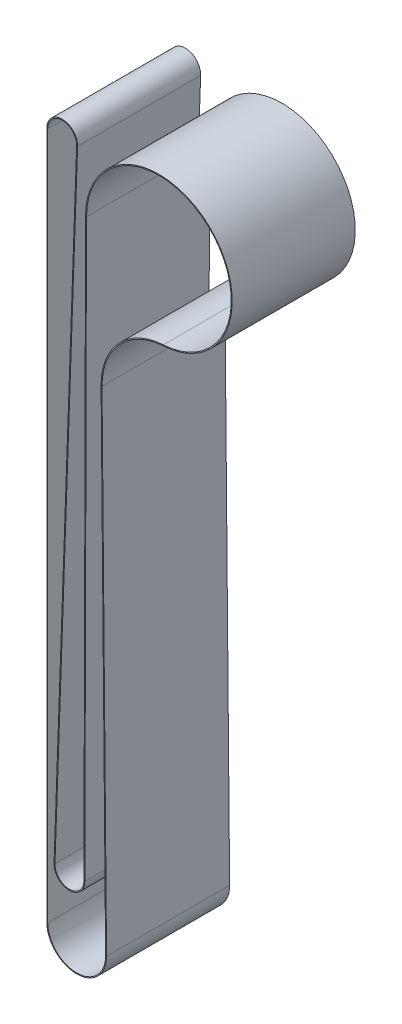
ISO-10303-21;
HEADER;
FILE_DESCRIPTION(('STEP AP214'),'2;1');
FILE_NAME('part.step','',(''),(''),'','','');
FILE_SCHEMA(('AUTOMOTIVE_DESIGN { 1 0 10303 214 1 1 1 1 }'));
ENDSEC;
DATA;
#1=APPLICATION_CONTEXT('core data for automotive mechanical design processes');
#2=APPLICATION_PROTOCOL_DEFINITION('international standard','automotive_design',2000,#1);
#3=PRODUCT_CONTEXT('',#1,'mechanical');
#4=PRODUCT('Part','Part','',(#3));
#5=PRODUCT_RELATED_PRODUCT_CATEGORY('part','',(#4));
#6=PRODUCT_DEFINITION_FORMATION('','',#4);
#7=PRODUCT_DEFINITION_CONTEXT('part definition',#1,'design');
#8=PRODUCT_DEFINITION('design','',#6,#7);
#9=PRODUCT_DEFINITION_SHAPE('','',#8);
#10=(LENGTH_UNIT() NAMED_UNIT(*) SI_UNIT(.MILLI.,.METRE.));
#11=(NAMED_UNIT(*) PLANE_ANGLE_UNIT() SI_UNIT($,.RADIAN.));
#12=(NAMED_UNIT(*) SI_UNIT($,.STERADIAN.) SOLID_ANGLE_UNIT());
#13=UNCERTAINTY_MEASURE_WITH_UNIT(LENGTH_MEASURE(1.E-05),#10,'distance_accuracy_value','');
#14=(GEOMETRIC_REPRESENTATION_CONTEXT(3) GLOBAL_UNCERTAINTY_ASSIGNED_CONTEXT((#13)) GLOBAL_UNIT_ASSIGNED_CONTEXT((#10,
#11,#12)) REPRESENTATION_CONTEXT('',''));
#15=CARTESIAN_POINT('',(0.,0.,0.));
#16=DIRECTION('',(0.,0.,1.));
#17=DIRECTION('',(1.,0.,0.));
#18=AXIS2_PLACEMENT_3D('',#15,#16,#17);
#19=CARTESIAN_POINT('',(3.746,15.0000000000001,34.));
#20=DIRECTION('',(1.,0.,0.));
#21=DIRECTION('',(0.,1.,0.));
#22=AXIS2_PLACEMENT_3D('',#19,#20,#21);
#23=PLANE('',#22);
#24=DIRECTION('',(0.,0.,1.));
#25=VECTOR('',#24,1.);
#26=CARTESIAN_POINT('',(3.746,173.,34.));
#27=LINE('',#26,#25);
#28=CARTESIAN_POINT('',(3.746,173.,0.));
#29=VERTEX_POINT('',#28);
#30=CARTESIAN_POINT('',(3.746,173.,34.));
#31=VERTEX_POINT('',#30);
#32=EDGE_CURVE('E11',#29,#31,#27,.T.);
#33=ORIENTED_EDGE('',*,*,#32,.F.);
#34=DIRECTION('',(0.,-1.,0.));
#35=VECTOR('',#34,1.);
#36=CARTESIAN_POINT('',(3.746,15.0000000000001,0.));
#37=LINE('',#36,#35);
#38=CARTESIAN_POINT('',(3.746,147.,0.));
#39=VERTEX_POINT('',#38);
#40=EDGE_CURVE('E317',#29,#39,#37,.T.);
#41=ORIENTED_EDGE('',*,*,#40,.T.);
#42=DIRECTION('',(0.,0.,1.));
#43=VECTOR('',#42,1.);
#44=CARTESIAN_POINT('',(3.746,147.,34.));
#45=LINE('',#44,#43);
#46=CARTESIAN_POINT('',(3.74599999999999,147.,34.));
#47=VERTEX_POINT('',#46);
#48=EDGE_CURVE('E46',#39,#47,#45,.T.);
#49=ORIENTED_EDGE('',*,*,#48,.T.);
#50=DIRECTION('',(0.,-1.,0.));
#51=VECTOR('',#50,1.);
#52=CARTESIAN_POINT('',(3.746,173.,34.));
#53=LINE('',#52,#51);
#54=EDGE_CURVE('E297',#31,#47,#53,.T.);
#55=ORIENTED_EDGE('',*,*,#54,.F.);
#56=EDGE_LOOP('',(#33,#41,#49,#55));
#57=FACE_BOUND('',#56,.T.);
#58=ADVANCED_FACE('F37',(#57),#23,.F.);
#59=ORIENTED_EDGE('',*,*,#48,.F.);
#60=CARTESIAN_POINT('',(3.746,121.,0.));
#61=VERTEX_POINT('',#60);
#62=EDGE_CURVE('E424',#39,#61,#37,.T.);
#63=ORIENTED_EDGE('',*,*,#62,.T.);
#64=DIRECTION('',(0.,0.,1.));
#65=VECTOR('',#64,1.);
#66=CARTESIAN_POINT('',(3.746,121.,34.));
#67=LINE('',#66,#65);
#68=CARTESIAN_POINT('',(3.74599999999999,121.,34.));
#69=VERTEX_POINT('',#68);
#70=EDGE_CURVE('E348',#61,#69,#67,.T.);
#71=ORIENTED_EDGE('',*,*,#70,.T.);
#72=EDGE_CURVE('E365',#47,#69,#53,.T.);
#73=ORIENTED_EDGE('',*,*,#72,.F.);
#74=EDGE_LOOP('',(#59,#63,#71,#73));
#75=FACE_BOUND('',#74,.T.);
#76=ADVANCED_FACE('F366',(#75),#23,.F.);
#77=DIRECTION('',(0.,0.,1.));
#78=VECTOR('',#77,1.);
#79=CARTESIAN_POINT('',(3.746,69.,34.));
#80=LINE('',#79,#78);
#81=CARTESIAN_POINT('',(3.746,69.,0.));
#82=VERTEX_POINT('',#81);
#83=CARTESIAN_POINT('',(3.74599999999999,69.,34.));
#84=VERTEX_POINT('',#83);
#85=EDGE_CURVE('E355',#82,#84,#80,.T.);
#86=ORIENTED_EDGE('',*,*,#85,.F.);
#87=CARTESIAN_POINT('',(3.746,43.,0.));
#88=VERTEX_POINT('',#87);
#89=EDGE_CURVE('E426',#82,#88,#37,.T.);
#90=ORIENTED_EDGE('',*,*,#89,.T.);
#91=DIRECTION('',(0.,0.,1.));
#92=VECTOR('',#91,1.);
#93=CARTESIAN_POINT('',(3.746,43.,34.));
#94=LINE('',#93,#92);
#95=CARTESIAN_POINT('',(3.74599999999998,43.,34.));
#96=VERTEX_POINT('',#95);
#97=EDGE_CURVE('E344',#88,#96,#94,.T.);
#98=ORIENTED_EDGE('',*,*,#97,.T.);
#99=EDGE_CURVE('E372',#84,#96,#53,.T.);
#100=ORIENTED_EDGE('',*,*,#99,.F.);
#101=EDGE_LOOP('',(#86,#90,#98,#100));
#102=FACE_BOUND('',#101,.T.);
#103=ADVANCED_FACE('F444',(#102),#23,.F.);
#104=CARTESIAN_POINT('',(3.746,95.,0.));
#105=VERTEX_POINT('',#104);
#106=EDGE_CURVE('E428',#105,#82,#37,.T.);
#107=ORIENTED_EDGE('',*,*,#106,.T.);
#108=ORIENTED_EDGE('',*,*,#85,.T.);
#109=CARTESIAN_POINT('',(3.74599999999999,95.,34.));
#110=VERTEX_POINT('',#109);
#111=EDGE_CURVE('E373',#110,#84,#53,.T.);
#112=ORIENTED_EDGE('',*,*,#111,.F.);
#113=DIRECTION('',(0.,0.,1.));
#114=VECTOR('',#113,1.);
#115=CARTESIAN_POINT('',(3.746,95.,34.));
#116=LINE('',#115,#114);
#117=EDGE_CURVE('E352',#105,#110,#116,.T.);
#118=ORIENTED_EDGE('',*,*,#117,.F.);
#119=EDGE_LOOP('',(#107,#108,#112,#118));
#120=FACE_BOUND('',#119,.T.);
#121=ADVANCED_FACE('F434',(#120),#23,.F.);
#122=EDGE_CURVE('E425',#61,#105,#37,.T.);
#123=ORIENTED_EDGE('',*,*,#122,.T.);
#124=ORIENTED_EDGE('',*,*,#117,.T.);
#125=EDGE_CURVE('E371',#69,#110,#53,.T.);
#126=ORIENTED_EDGE('',*,*,#125,.F.);
#127=ORIENTED_EDGE('',*,*,#70,.F.);
#128=EDGE_LOOP('',(#123,#124,#126,#127));
#129=FACE_BOUND('',#128,.T.);
#130=ADVANCED_FACE('F437',(#129),#23,.F.);
#131=ORIENTED_EDGE('',*,*,#97,.F.);
#132=CARTESIAN_POINT('',(3.746,15.0000000000001,0.));
#133=VERTEX_POINT('',#132);
#134=EDGE_CURVE('E315',#88,#133,#37,.T.);
#135=ORIENTED_EDGE('',*,*,#134,.T.);
#136=DIRECTION('',(0.,0.,-1.));
#137=VECTOR('',#136,1.);
#138=CARTESIAN_POINT('',(3.746,15.0000000000001,34.));
#139=LINE('',#138,#137);
#140=CARTESIAN_POINT('',(3.746,15.0000000000001,34.));
#141=VERTEX_POINT('',#140);
#142=EDGE_CURVE('E296',#141,#133,#139,.T.);
#143=ORIENTED_EDGE('',*,*,#142,.F.);
#144=EDGE_CURVE('E292',#96,#141,#53,.T.);
#145=ORIENTED_EDGE('',*,*,#144,.F.);
#146=EDGE_LOOP('',(#131,#135,#143,#145));
#147=FACE_BOUND('',#146,.T.);
#148=ADVANCED_FACE('F382',(#147),#23,.F.);
#149=CARTESIAN_POINT('',(12.,15.0000000000001,34.));
#150=DIRECTION('',(0.,0.,-1.));
#151=DIRECTION('',(-1.,0.,0.));
#152=AXIS2_PLACEMENT_3D('',#149,#150,#151);
#153=PLANE('',#152);
#154=CARTESIAN_POINT('',(12.,15.0000000000001,34.));
#155=DIRECTION('',(0.,0.,1.));
#156=DIRECTION('',(-1.,0.,0.));
#157=AXIS2_PLACEMENT_3D('',#154,#155,#156);
#158=CIRCLE('',#157,8.254);
#159=CARTESIAN_POINT('',(20.2536485220883,15.0761713452046,34.));
#160=VERTEX_POINT('',#159);
#161=EDGE_CURVE('E274',#141,#160,#158,.T.);
#162=ORIENTED_EDGE('',*,*,#161,.T.);
#163=DIRECTION('',(-0.0092284159443135,0.999957417262935,0.));
#164=VECTOR('',#163,1.);
#165=CARTESIAN_POINT('',(19.0007664892672,150.833888513003,34.));
#166=LINE('',#165,#164);
#167=CARTESIAN_POINT('',(19.0007664892672,150.833888513003,34.));
#168=VERTEX_POINT('',#167);
#169=EDGE_CURVE('E277',#160,#168,#166,.T.);
#170=ORIENTED_EDGE('',*,*,#169,.T.);
#171=CARTESIAN_POINT('',(37.,151.,34.));
#172=DIRECTION('',(0.,0.,-1.));
#173=DIRECTION('',(1.,0.,0.));
#174=AXIS2_PLACEMENT_3D('',#171,#172,#173);
#175=CIRCLE('',#174,18.);
#176=CARTESIAN_POINT('',(35.9238875208598,168.967804037562,34.));
#177=VERTEX_POINT('',#176);
#178=EDGE_CURVE('E280',#168,#177,#175,.T.);
#179=ORIENTED_EDGE('',*,*,#178,.T.);
#180=CARTESIAN_POINT('',(34.7130218457207,189.185576425162,34.));
#181=DIRECTION('',(0.,0.,1.));
#182=DIRECTION('',(-1.,0.,0.));
#183=AXIS2_PLACEMENT_3D('',#180,#181,#182);
#184=CIRCLE('',#183,20.254);
#185=CARTESIAN_POINT('',(14.4591060136495,189.243967069767,34.));
#186=VERTEX_POINT('',#185);
#187=EDGE_CURVE('E282',#177,#186,#184,.T.);
#188=ORIENTED_EDGE('',*,*,#187,.T.);
#189=DIRECTION('',(-0.00288291915698112,-0.999995844379933,0.));
#190=VECTOR('',#189,1.);
#191=CARTESIAN_POINT('',(13.9999833775197,29.9884683233723,34.));
#192=LINE('',#191,#190);
#193=CARTESIAN_POINT('',(13.9999833775197,29.9884683233723,34.));
#194=VERTEX_POINT('',#193);
#195=EDGE_CURVE('E284',#186,#194,#192,.T.);
#196=ORIENTED_EDGE('',*,*,#195,.T.);
#197=CARTESIAN_POINT('',(10.,30.0000000000001,34.));
#198=DIRECTION('',(0.,0.,-1.));
#199=DIRECTION('',(1.,0.,0.));
#200=AXIS2_PLACEMENT_3D('',#197,#198,#199);
#201=CIRCLE('',#200,4.);
#202=CARTESIAN_POINT('',(6.00255614759545,30.142977784544,34.));
#203=VERTEX_POINT('',#202);
#204=EDGE_CURVE('E286',#194,#203,#201,.T.);
#205=ORIENTED_EDGE('',*,*,#204,.T.);
#206=DIRECTION('',(0.035744446135987,0.999360963101137,0.));
#207=VECTOR('',#206,1.);
#208=CARTESIAN_POINT('',(12.2512815370322,204.847943126138,34.));
#209=LINE('',#208,#207);
#210=CARTESIAN_POINT('',(12.2512815370322,204.847943126138,34.));
#211=VERTEX_POINT('',#210);
#212=EDGE_CURVE('E288',#203,#211,#209,.T.);
#213=ORIENTED_EDGE('',*,*,#212,.T.);
#214=CARTESIAN_POINT('',(8.,205.,34.));
#215=DIRECTION('',(0.,0.,1.));
#216=DIRECTION('',(-1.,0.,0.));
#217=AXIS2_PLACEMENT_3D('',#214,#215,#216);
#218=CIRCLE('',#217,4.254);
#219=CARTESIAN_POINT('',(3.746,205.,34.));
#220=VERTEX_POINT('',#219);
#221=EDGE_CURVE('E290',#211,#220,#218,.T.);
#222=ORIENTED_EDGE('',*,*,#221,.T.);
#223=EDGE_CURVE('E293',#220,#31,#53,.T.);
#224=ORIENTED_EDGE('',*,*,#223,.T.);
#225=ORIENTED_EDGE('',*,*,#54,.T.);
#226=ORIENTED_EDGE('',*,*,#72,.T.);
#227=ORIENTED_EDGE('',*,*,#125,.T.);
#228=ORIENTED_EDGE('',*,*,#111,.T.);
#229=ORIENTED_EDGE('',*,*,#99,.T.);
#230=ORIENTED_EDGE('',*,*,#144,.T.);
#231=EDGE_LOOP('',(#162,#170,#179,#188,#196,#205,#213,#222,#224,#225,#226,#227,#228,#229,#230));
#232=FACE_BOUND('',#231,.T.);
#233=CARTESIAN_POINT('',(12.,15.0000000000001,34.));
#234=DIRECTION('',(0.,0.,1.));
#235=DIRECTION('',(-1.,0.,0.));
#236=AXIS2_PLACEMENT_3D('',#233,#234,#235);
#237=CIRCLE('',#236,8.);
#238=CARTESIAN_POINT('',(3.99999999999999,15.0000000000001,34.));
#239=VERTEX_POINT('',#238);
#240=CARTESIAN_POINT('',(19.9996593381035,15.0738273275547,34.));
#241=VERTEX_POINT('',#240);
#242=EDGE_CURVE('E206',#239,#241,#237,.T.);
#243=ORIENTED_EDGE('',*,*,#242,.F.);
#244=DIRECTION('',(0.,-1.,0.));
#245=VECTOR('',#244,1.);
#246=CARTESIAN_POINT('',(4.,15.0000000000001,34.));
#247=LINE('',#246,#245);
#248=CARTESIAN_POINT('',(4.,205.,34.));
#249=VERTEX_POINT('',#248);
#250=EDGE_CURVE('E195',#249,#239,#247,.T.);
#251=ORIENTED_EDGE('',*,*,#250,.F.);
#252=CARTESIAN_POINT('',(8.,205.,34.));
#253=DIRECTION('',(0.,0.,1.));
#254=DIRECTION('',(-1.,0.,0.));
#255=AXIS2_PLACEMENT_3D('',#252,#253,#254);
#256=CIRCLE('',#255,4.);
#257=CARTESIAN_POINT('',(11.9974438524045,204.857022215456,34.));
#258=VERTEX_POINT('',#257);
#259=EDGE_CURVE('E235',#258,#249,#256,.T.);
#260=ORIENTED_EDGE('',*,*,#259,.F.);
#261=DIRECTION('',(0.035744446135987,0.999360963101137,0.));
#262=VECTOR('',#261,1.);
#263=CARTESIAN_POINT('',(11.9974438524045,204.857022215456,34.));
#264=LINE('',#263,#262);
#265=CARTESIAN_POINT('',(5.74871846296776,30.1520568738626,34.));
#266=VERTEX_POINT('',#265);
#267=EDGE_CURVE('E233',#266,#258,#264,.T.);
#268=ORIENTED_EDGE('',*,*,#267,.F.);
#269=CARTESIAN_POINT('',(10.,30.0000000000001,34.));
#270=DIRECTION('',(0.,0.,-1.));
#271=DIRECTION('',(1.,0.,0.));
#272=AXIS2_PLACEMENT_3D('',#269,#270,#271);
#273=CIRCLE('',#272,4.254);
#274=CARTESIAN_POINT('',(14.2539823219922,29.9877360619064,34.));
#275=VERTEX_POINT('',#274);
#276=EDGE_CURVE('E231',#275,#266,#273,.T.);
#277=ORIENTED_EDGE('',*,*,#276,.F.);
#278=DIRECTION('',(-0.00288291915698112,-0.999995844379932,0.));
#279=VECTOR('',#278,1.);
#280=CARTESIAN_POINT('',(14.2539823219922,29.9877360619064,34.));
#281=LINE('',#280,#279);
#282=CARTESIAN_POINT('',(14.713104958122,189.243234808301,34.));
#283=VERTEX_POINT('',#282);
#284=EDGE_CURVE('E229',#283,#275,#281,.T.);
#285=ORIENTED_EDGE('',*,*,#284,.F.);
#286=CARTESIAN_POINT('',(34.7130218457207,189.185576425162,34.));
#287=DIRECTION('',(0.,0.,1.));
#288=DIRECTION('',(-1.,0.,0.));
#289=AXIS2_PLACEMENT_3D('',#286,#287,#288);
#290=CIRCLE('',#289,20.);
#291=CARTESIAN_POINT('',(35.9087023780986,169.221349716759,34.));
#292=VERTEX_POINT('',#291);
#293=EDGE_CURVE('E227',#292,#283,#290,.T.);
#294=ORIENTED_EDGE('',*,*,#293,.F.);
#295=CARTESIAN_POINT('',(37.,151.,34.));
#296=DIRECTION('',(0.,0.,-1.));
#297=DIRECTION('',(1.,0.,0.));
#298=AXIS2_PLACEMENT_3D('',#295,#296,#297);
#299=CIRCLE('',#298,18.254);
#300=CARTESIAN_POINT('',(18.7467773052824,150.831544495353,34.));
#301=VERTEX_POINT('',#300);
#302=EDGE_CURVE('E223',#301,#292,#299,.T.);
#303=ORIENTED_EDGE('',*,*,#302,.F.);
#304=DIRECTION('',(-0.0092284159443136,0.999957417262935,0.));
#305=VECTOR('',#304,1.);
#306=CARTESIAN_POINT('',(18.7467773052824,150.831544495353,34.));
#307=LINE('',#306,#305);
#308=EDGE_CURVE('E221',#241,#301,#307,.T.);
#309=ORIENTED_EDGE('',*,*,#308,.F.);
#310=EDGE_LOOP('',(#243,#251,#260,#268,#277,#285,#294,#303,#309));
#311=FACE_BOUND('',#310,.T.);
#312=ADVANCED_FACE('F219',(#232,#311),#153,.F.);
#313=CARTESIAN_POINT('',(12.,15.0000000000001,0.));
#314=DIRECTION('',(0.,0.,-1.));
#315=DIRECTION('',(-1.,0.,0.));
#316=AXIS2_PLACEMENT_3D('',#313,#314,#315);
#317=PLANE('',#316);
#318=CARTESIAN_POINT('',(12.,15.0000000000001,0.));
#319=DIRECTION('',(0.,0.,1.));
#320=DIRECTION('',(-1.,0.,0.));
#321=AXIS2_PLACEMENT_3D('',#318,#319,#320);
#322=CIRCLE('',#321,8.254);
#323=CARTESIAN_POINT('',(20.2536485220883,15.0761713452046,0.));
#324=VERTEX_POINT('',#323);
#325=EDGE_CURVE('E215',#133,#324,#322,.T.);
#326=ORIENTED_EDGE('',*,*,#325,.F.);
#327=ORIENTED_EDGE('',*,*,#134,.F.);
#328=ORIENTED_EDGE('',*,*,#89,.F.);
#329=ORIENTED_EDGE('',*,*,#106,.F.);
#330=ORIENTED_EDGE('',*,*,#122,.F.);
#331=ORIENTED_EDGE('',*,*,#62,.F.);
#332=ORIENTED_EDGE('',*,*,#40,.F.);
#333=CARTESIAN_POINT('',(3.746,205.,0.));
#334=VERTEX_POINT('',#333);
#335=EDGE_CURVE('E278',#334,#29,#37,.T.);
#336=ORIENTED_EDGE('',*,*,#335,.F.);
#337=CARTESIAN_POINT('',(8.,205.,0.));
#338=DIRECTION('',(0.,0.,1.));
#339=DIRECTION('',(-1.,0.,0.));
#340=AXIS2_PLACEMENT_3D('',#337,#338,#339);
#341=CIRCLE('',#340,4.254);
#342=CARTESIAN_POINT('',(12.2512815370322,204.847943126138,0.));
#343=VERTEX_POINT('',#342);
#344=EDGE_CURVE('E312',#343,#334,#341,.T.);
#345=ORIENTED_EDGE('',*,*,#344,.F.);
#346=DIRECTION('',(0.035744446135987,0.999360963101137,0.));
#347=VECTOR('',#346,1.);
#348=CARTESIAN_POINT('',(12.2512815370322,204.847943126138,0.));
#349=LINE('',#348,#347);
#350=CARTESIAN_POINT('',(6.00255614759545,30.142977784544,0.));
#351=VERTEX_POINT('',#350);
#352=EDGE_CURVE('E310',#351,#343,#349,.T.);
#353=ORIENTED_EDGE('',*,*,#352,.F.);
#354=CARTESIAN_POINT('',(10.,30.0000000000001,0.));
#355=DIRECTION('',(0.,0.,-1.));
#356=DIRECTION('',(1.,0.,0.));
#357=AXIS2_PLACEMENT_3D('',#354,#355,#356);
#358=CIRCLE('',#357,4.);
#359=CARTESIAN_POINT('',(13.9999833775197,29.9884683233723,0.));
#360=VERTEX_POINT('',#359);
#361=EDGE_CURVE('E308',#360,#351,#358,.T.);
#362=ORIENTED_EDGE('',*,*,#361,.F.);
#363=DIRECTION('',(-0.00288291915698112,-0.999995844379933,0.));
#364=VECTOR('',#363,1.);
#365=CARTESIAN_POINT('',(13.9999833775197,29.9884683233723,0.));
#366=LINE('',#365,#364);
#367=CARTESIAN_POINT('',(14.4591060136495,189.243967069767,0.));
#368=VERTEX_POINT('',#367);
#369=EDGE_CURVE('E306',#368,#360,#366,.T.);
#370=ORIENTED_EDGE('',*,*,#369,.F.);
#371=CARTESIAN_POINT('',(34.7130218457207,189.185576425162,0.));
#372=DIRECTION('',(0.,0.,1.));
#373=DIRECTION('',(-1.,0.,0.));
#374=AXIS2_PLACEMENT_3D('',#371,#372,#373);
#375=CIRCLE('',#374,20.254);
#376=CARTESIAN_POINT('',(35.9238875208598,168.967804037562,0.));
#377=VERTEX_POINT('',#376);
#378=EDGE_CURVE('E304',#377,#368,#375,.T.);
#379=ORIENTED_EDGE('',*,*,#378,.F.);
#380=CARTESIAN_POINT('',(37.,151.,0.));
#381=DIRECTION('',(0.,0.,-1.));
#382=DIRECTION('',(1.,0.,0.));
#383=AXIS2_PLACEMENT_3D('',#380,#381,#382);
#384=CIRCLE('',#383,18.);
#385=CARTESIAN_POINT('',(19.0007664892672,150.833888513003,0.));
#386=VERTEX_POINT('',#385);
#387=EDGE_CURVE('E302',#386,#377,#384,.T.);
#388=ORIENTED_EDGE('',*,*,#387,.F.);
#389=DIRECTION('',(-0.0092284159443135,0.999957417262935,0.));
#390=VECTOR('',#389,1.);
#391=CARTESIAN_POINT('',(19.0007664892672,150.833888513003,0.));
#392=LINE('',#391,#390);
#393=EDGE_CURVE('E300',#324,#386,#392,.T.);
#394=ORIENTED_EDGE('',*,*,#393,.F.);
#395=EDGE_LOOP('',(#326,#327,#328,#329,#330,#331,#332,#336,#345,#353,#362,#370,#379,#388,#394));
#396=FACE_BOUND('',#395,.T.);
#397=DIRECTION('',(0.,-1.,0.));
#398=VECTOR('',#397,1.);
#399=CARTESIAN_POINT('',(4.,43.0000000000001,0.));
#400=LINE('',#399,#398);
#401=CARTESIAN_POINT('',(4.,205.,0.));
#402=VERTEX_POINT('',#401);
#403=CARTESIAN_POINT('',(4.,15.0000000000001,0.));
#404=VERTEX_POINT('',#403);
#405=EDGE_CURVE('E207',#402,#404,#400,.T.);
#406=ORIENTED_EDGE('',*,*,#405,.T.);
#407=CARTESIAN_POINT('',(12.,15.0000000000001,0.));
#408=DIRECTION('',(0.,0.,1.));
#409=DIRECTION('',(-1.,0.,0.));
#410=AXIS2_PLACEMENT_3D('',#407,#408,#409);
#411=CIRCLE('',#410,8.);
#412=CARTESIAN_POINT('',(19.9996593381035,15.0738273275547,0.));
#413=VERTEX_POINT('',#412);
#414=EDGE_CURVE('E213',#404,#413,#411,.T.);
#415=ORIENTED_EDGE('',*,*,#414,.T.);
#416=DIRECTION('',(-0.0092284159443136,0.999957417262935,0.));
#417=VECTOR('',#416,1.);
#418=CARTESIAN_POINT('',(18.7467773052824,150.831544495353,0.));
#419=LINE('',#418,#417);
#420=CARTESIAN_POINT('',(18.7467773052824,150.831544495353,0.));
#421=VERTEX_POINT('',#420);
#422=EDGE_CURVE('E238',#413,#421,#419,.T.);
#423=ORIENTED_EDGE('',*,*,#422,.T.);
#424=CARTESIAN_POINT('',(37.,151.,0.));
#425=DIRECTION('',(0.,0.,-1.));
#426=DIRECTION('',(1.,0.,0.));
#427=AXIS2_PLACEMENT_3D('',#424,#425,#426);
#428=CIRCLE('',#427,18.254);
#429=CARTESIAN_POINT('',(35.9087023780986,169.221349716759,0.));
#430=VERTEX_POINT('',#429);
#431=EDGE_CURVE('E241',#421,#430,#428,.T.);
#432=ORIENTED_EDGE('',*,*,#431,.T.);
#433=CARTESIAN_POINT('',(34.7130218457207,189.185576425162,0.));
#434=DIRECTION('',(0.,0.,1.));
#435=DIRECTION('',(-1.,0.,0.));
#436=AXIS2_PLACEMENT_3D('',#433,#434,#435);
#437=CIRCLE('',#436,20.);
#438=CARTESIAN_POINT('',(14.713104958122,189.243234808301,0.));
#439=VERTEX_POINT('',#438);
#440=EDGE_CURVE('E244',#430,#439,#437,.T.);
#441=ORIENTED_EDGE('',*,*,#440,.T.);
#442=DIRECTION('',(-0.00288291915698112,-0.999995844379932,0.));
#443=VECTOR('',#442,1.);
#444=CARTESIAN_POINT('',(14.2539823219922,29.9877360619064,0.));
#445=LINE('',#444,#443);
#446=CARTESIAN_POINT('',(14.2539823219922,29.9877360619064,0.));
#447=VERTEX_POINT('',#446);
#448=EDGE_CURVE('E247',#439,#447,#445,.T.);
#449=ORIENTED_EDGE('',*,*,#448,.T.);
#450=CARTESIAN_POINT('',(10.,30.0000000000001,0.));
#451=DIRECTION('',(0.,0.,-1.));
#452=DIRECTION('',(1.,0.,0.));
#453=AXIS2_PLACEMENT_3D('',#450,#451,#452);
#454=CIRCLE('',#453,4.254);
#455=CARTESIAN_POINT('',(5.74871846296776,30.1520568738626,0.));
#456=VERTEX_POINT('',#455);
#457=EDGE_CURVE('E250',#447,#456,#454,.T.);
#458=ORIENTED_EDGE('',*,*,#457,.T.);
#459=DIRECTION('',(0.035744446135987,0.999360963101137,0.));
#460=VECTOR('',#459,1.);
#461=CARTESIAN_POINT('',(11.9974438524045,204.857022215456,0.));
#462=LINE('',#461,#460);
#463=CARTESIAN_POINT('',(11.9974438524045,204.857022215456,0.));
#464=VERTEX_POINT('',#463);
#465=EDGE_CURVE('E253',#456,#464,#462,.T.);
#466=ORIENTED_EDGE('',*,*,#465,.T.);
#467=CARTESIAN_POINT('',(8.,205.,0.));
#468=DIRECTION('',(0.,0.,1.));
#469=DIRECTION('',(-1.,0.,0.));
#470=AXIS2_PLACEMENT_3D('',#467,#468,#469);
#471=CIRCLE('',#470,4.);
#472=EDGE_CURVE('E256',#464,#402,#471,.T.);
#473=ORIENTED_EDGE('',*,*,#472,.T.);
#474=EDGE_LOOP('',(#406,#415,#423,#432,#441,#449,#458,#466,#473));
#475=FACE_BOUND('',#474,.T.);
#476=ADVANCED_FACE('F421',(#396,#475),#317,.T.);
#477=CARTESIAN_POINT('',(12.,15.0000000000001,34.));
#478=DIRECTION('',(0.,0.,-1.));
#479=DIRECTION('',(-1.,0.,0.));
#480=AXIS2_PLACEMENT_3D('',#477,#478,#479);
#481=CYLINDRICAL_SURFACE('',#480,8.254);
#482=ORIENTED_EDGE('',*,*,#325,.T.);
#483=DIRECTION('',(0.,0.,-1.));
#484=VECTOR('',#483,1.);
#485=CARTESIAN_POINT('',(20.2536485220883,15.0761713452046,34.));
#486=LINE('',#485,#484);
#487=EDGE_CURVE('E341',#160,#324,#486,.T.);
#488=ORIENTED_EDGE('',*,*,#487,.F.);
#489=ORIENTED_EDGE('',*,*,#161,.F.);
#490=ORIENTED_EDGE('',*,*,#142,.T.);
#491=EDGE_LOOP('',(#482,#488,#489,#490));
#492=FACE_BOUND('',#491,.T.);
#493=ADVANCED_FACE('F39',(#492),#481,.T.);
#494=CARTESIAN_POINT('',(19.0007664892672,150.833888513003,34.));
#495=DIRECTION('',(-0.999957417262935,-0.0092284159443135,0.));
#496=DIRECTION('',(0.0092284159443135,-0.999957417262935,0.));
#497=AXIS2_PLACEMENT_3D('',#494,#495,#496);
#498=PLANE('',#497);
#499=ORIENTED_EDGE('',*,*,#393,.T.);
#500=DIRECTION('',(0.,0.,-1.));
#501=VECTOR('',#500,1.);
#502=CARTESIAN_POINT('',(19.0007664892672,150.833888513003,34.));
#503=LINE('',#502,#501);
#504=EDGE_CURVE('E338',#168,#386,#503,.T.);
#505=ORIENTED_EDGE('',*,*,#504,.F.);
#506=ORIENTED_EDGE('',*,*,#169,.F.);
#507=ORIENTED_EDGE('',*,*,#487,.T.);
#508=EDGE_LOOP('',(#499,#505,#506,#507));
#509=FACE_BOUND('',#508,.T.);
#510=ADVANCED_FACE('F387',(#509),#498,.F.);
#511=CARTESIAN_POINT('',(37.,151.,34.));
#512=DIRECTION('',(0.,0.,-1.));
#513=DIRECTION('',(-1.,0.,0.));
#514=AXIS2_PLACEMENT_3D('',#511,#512,#513);
#515=CYLINDRICAL_SURFACE('',#514,18.);
#516=ORIENTED_EDGE('',*,*,#387,.T.);
#517=DIRECTION('',(0.,0.,-1.));
#518=VECTOR('',#517,1.);
#519=CARTESIAN_POINT('',(35.9238875208598,168.967804037562,34.));
#520=LINE('',#519,#518);
#521=EDGE_CURVE('E335',#177,#377,#520,.T.);
#522=ORIENTED_EDGE('',*,*,#521,.F.);
#523=ORIENTED_EDGE('',*,*,#178,.F.);
#524=ORIENTED_EDGE('',*,*,#504,.T.);
#525=EDGE_LOOP('',(#516,#522,#523,#524));
#526=FACE_BOUND('',#525,.T.);
#527=ADVANCED_FACE('F394',(#526),#515,.F.);
#528=CARTESIAN_POINT('',(34.7130218457207,189.185576425162,34.));
#529=DIRECTION('',(0.,0.,-1.));
#530=DIRECTION('',(-1.,0.,0.));
#531=AXIS2_PLACEMENT_3D('',#528,#529,#530);
#532=CYLINDRICAL_SURFACE('',#531,20.254);
#533=ORIENTED_EDGE('',*,*,#378,.T.);
#534=DIRECTION('',(0.,0.,-1.));
#535=VECTOR('',#534,1.);
#536=CARTESIAN_POINT('',(14.4591060136495,189.243967069767,34.));
#537=LINE('',#536,#535);
#538=EDGE_CURVE('E332',#186,#368,#537,.T.);
#539=ORIENTED_EDGE('',*,*,#538,.F.);
#540=ORIENTED_EDGE('',*,*,#187,.F.);
#541=ORIENTED_EDGE('',*,*,#521,.T.);
#542=EDGE_LOOP('',(#533,#539,#540,#541));
#543=FACE_BOUND('',#542,.T.);
#544=ADVANCED_FACE('F398',(#543),#532,.T.);
#545=CARTESIAN_POINT('',(13.9999833775197,29.9884683233723,34.));
#546=DIRECTION('',(0.999995844379933,-0.00288291915698112,0.));
#547=DIRECTION('',(0.00288291915698112,0.999995844379933,0.));
#548=AXIS2_PLACEMENT_3D('',#545,#546,#547);
#549=PLANE('',#548);
#550=ORIENTED_EDGE('',*,*,#369,.T.);
#551=DIRECTION('',(0.,0.,-1.));
#552=VECTOR('',#551,1.);
#553=CARTESIAN_POINT('',(13.9999833775197,29.9884683233723,34.));
#554=LINE('',#553,#552);
#555=EDGE_CURVE('E329',#194,#360,#554,.T.);
#556=ORIENTED_EDGE('',*,*,#555,.F.);
#557=ORIENTED_EDGE('',*,*,#195,.F.);
#558=ORIENTED_EDGE('',*,*,#538,.T.);
#559=EDGE_LOOP('',(#550,#556,#557,#558));
#560=FACE_BOUND('',#559,.T.);
#561=ADVANCED_FACE('F403',(#560),#549,.F.);
#562=CARTESIAN_POINT('',(10.,30.0000000000001,34.));
#563=DIRECTION('',(0.,0.,-1.));
#564=DIRECTION('',(-1.,0.,0.));
#565=AXIS2_PLACEMENT_3D('',#562,#563,#564);
#566=CYLINDRICAL_SURFACE('',#565,4.);
#567=ORIENTED_EDGE('',*,*,#361,.T.);
#568=DIRECTION('',(0.,0.,-1.));
#569=VECTOR('',#568,1.);
#570=CARTESIAN_POINT('',(6.00255614759545,30.142977784544,34.));
#571=LINE('',#570,#569);
#572=EDGE_CURVE('E326',#203,#351,#571,.T.);
#573=ORIENTED_EDGE('',*,*,#572,.F.);
#574=ORIENTED_EDGE('',*,*,#204,.F.);
#575=ORIENTED_EDGE('',*,*,#555,.T.);
#576=EDGE_LOOP('',(#567,#573,#574,#575));
#577=FACE_BOUND('',#576,.T.);
#578=ADVANCED_FACE('F409',(#577),#566,.F.);
#579=CARTESIAN_POINT('',(12.2512815370322,204.847943126138,34.));
#580=DIRECTION('',(-0.999360963101137,0.035744446135987,0.));
#581=DIRECTION('',(-0.035744446135987,-0.999360963101137,0.));
#582=AXIS2_PLACEMENT_3D('',#579,#580,#581);
#583=PLANE('',#582);
#584=ORIENTED_EDGE('',*,*,#352,.T.);
#585=DIRECTION('',(0.,0.,-1.));
#586=VECTOR('',#585,1.);
#587=CARTESIAN_POINT('',(12.2512815370322,204.847943126138,34.));
#588=LINE('',#587,#586);
#589=EDGE_CURVE('E323',#211,#343,#588,.T.);
#590=ORIENTED_EDGE('',*,*,#589,.F.);
#591=ORIENTED_EDGE('',*,*,#212,.F.);
#592=ORIENTED_EDGE('',*,*,#572,.T.);
#593=EDGE_LOOP('',(#584,#590,#591,#592));
#594=FACE_BOUND('',#593,.T.);
#595=ADVANCED_FACE('F413',(#594),#583,.F.);
#596=CARTESIAN_POINT('',(8.,205.,34.));
#597=DIRECTION('',(0.,0.,-1.));
#598=DIRECTION('',(-1.,0.,0.));
#599=AXIS2_PLACEMENT_3D('',#596,#597,#598);
#600=CYLINDRICAL_SURFACE('',#599,4.254);
#601=ORIENTED_EDGE('',*,*,#344,.T.);
#602=DIRECTION('',(0.,0.,-1.));
#603=VECTOR('',#602,1.);
#604=CARTESIAN_POINT('',(3.746,205.,34.));
#605=LINE('',#604,#603);
#606=EDGE_CURVE('E320',#220,#334,#605,.T.);
#607=ORIENTED_EDGE('',*,*,#606,.F.);
#608=ORIENTED_EDGE('',*,*,#221,.F.);
#609=ORIENTED_EDGE('',*,*,#589,.T.);
#610=EDGE_LOOP('',(#601,#607,#608,#609));
#611=FACE_BOUND('',#610,.T.);
#612=ADVANCED_FACE('F418',(#611),#600,.T.);
#613=ORIENTED_EDGE('',*,*,#335,.T.);
#614=ORIENTED_EDGE('',*,*,#32,.T.);
#615=ORIENTED_EDGE('',*,*,#223,.F.);
#616=ORIENTED_EDGE('',*,*,#606,.T.);
#617=EDGE_LOOP('',(#613,#614,#615,#616));
#618=FACE_BOUND('',#617,.T.);
#619=ADVANCED_FACE('F419',(#618),#23,.F.);
#620=CARTESIAN_POINT('',(12.,15.0000000000001,34.));
#621=DIRECTION('',(0.,0.,-1.));
#622=DIRECTION('',(-1.,0.,0.));
#623=AXIS2_PLACEMENT_3D('',#620,#621,#622);
#624=CYLINDRICAL_SURFACE('',#623,8.);
#625=ORIENTED_EDGE('',*,*,#414,.F.);
#626=DIRECTION('',(0.,0.,-1.));
#627=VECTOR('',#626,1.);
#628=CARTESIAN_POINT('',(3.99999999999999,15.0000000000001,34.));
#629=LINE('',#628,#627);
#630=EDGE_CURVE('E198',#239,#404,#629,.T.);
#631=ORIENTED_EDGE('',*,*,#630,.F.);
#632=ORIENTED_EDGE('',*,*,#242,.T.);
#633=DIRECTION('',(0.,0.,-1.));
#634=VECTOR('',#633,1.);
#635=CARTESIAN_POINT('',(19.9996593381035,15.0738273275547,34.));
#636=LINE('',#635,#634);
#637=EDGE_CURVE('E216',#241,#413,#636,.T.);
#638=ORIENTED_EDGE('',*,*,#637,.T.);
#639=EDGE_LOOP('',(#625,#631,#632,#638));
#640=FACE_BOUND('',#639,.T.);
#641=ADVANCED_FACE('F210',(#640),#624,.F.);
#642=CARTESIAN_POINT('',(18.7467773052824,150.831544495353,34.));
#643=DIRECTION('',(-0.999957417262935,-0.0092284159443136,0.));
#644=DIRECTION('',(0.0092284159443136,-0.999957417262935,0.));
#645=AXIS2_PLACEMENT_3D('',#642,#643,#644);
#646=PLANE('',#645);
#647=ORIENTED_EDGE('',*,*,#422,.F.);
#648=ORIENTED_EDGE('',*,*,#637,.F.);
#649=ORIENTED_EDGE('',*,*,#308,.T.);
#650=DIRECTION('',(0.,0.,-1.));
#651=VECTOR('',#650,1.);
#652=CARTESIAN_POINT('',(18.7467773052824,150.831544495353,34.));
#653=LINE('',#652,#651);
#654=EDGE_CURVE('E271',#301,#421,#653,.T.);
#655=ORIENTED_EDGE('',*,*,#654,.T.);
#656=EDGE_LOOP('',(#647,#648,#649,#655));
#657=FACE_BOUND('',#656,.T.);
#658=ADVANCED_FACE('F456',(#657),#646,.T.);
#659=CARTESIAN_POINT('',(37.,151.,34.));
#660=DIRECTION('',(0.,0.,-1.));
#661=DIRECTION('',(-1.,0.,0.));
#662=AXIS2_PLACEMENT_3D('',#659,#660,#661);
#663=CYLINDRICAL_SURFACE('',#662,18.254);
#664=ORIENTED_EDGE('',*,*,#431,.F.);
#665=ORIENTED_EDGE('',*,*,#654,.F.);
#666=ORIENTED_EDGE('',*,*,#302,.T.);
#667=DIRECTION('',(0.,0.,-1.));
#668=VECTOR('',#667,1.);
#669=CARTESIAN_POINT('',(35.9087023780986,169.221349716759,34.));
#670=LINE('',#669,#668);
#671=EDGE_CURVE('E269',#292,#430,#670,.T.);
#672=ORIENTED_EDGE('',*,*,#671,.T.);
#673=EDGE_LOOP('',(#664,#665,#666,#672));
#674=FACE_BOUND('',#673,.T.);
#675=ADVANCED_FACE('F484',(#674),#663,.T.);
#676=CARTESIAN_POINT('',(34.7130218457207,189.185576425162,34.));
#677=DIRECTION('',(0.,0.,-1.));
#678=DIRECTION('',(-1.,0.,0.));
#679=AXIS2_PLACEMENT_3D('',#676,#677,#678);
#680=CYLINDRICAL_SURFACE('',#679,20.);
#681=ORIENTED_EDGE('',*,*,#440,.F.);
#682=ORIENTED_EDGE('',*,*,#671,.F.);
#683=ORIENTED_EDGE('',*,*,#293,.T.);
#684=DIRECTION('',(0.,0.,-1.));
#685=VECTOR('',#684,1.);
#686=CARTESIAN_POINT('',(14.713104958122,189.243234808301,34.));
#687=LINE('',#686,#685);
#688=EDGE_CURVE('E267',#283,#439,#687,.T.);
#689=ORIENTED_EDGE('',*,*,#688,.T.);
#690=EDGE_LOOP('',(#681,#682,#683,#689));
#691=FACE_BOUND('',#690,.T.);
#692=ADVANCED_FACE('F488',(#691),#680,.F.);
#693=CARTESIAN_POINT('',(14.2539823219922,29.9877360619064,34.));
#694=DIRECTION('',(0.999995844379933,-0.00288291915698112,0.));
#695=DIRECTION('',(0.00288291915698112,0.999995844379933,0.));
#696=AXIS2_PLACEMENT_3D('',#693,#694,#695);
#697=PLANE('',#696);
#698=ORIENTED_EDGE('',*,*,#448,.F.);
#699=ORIENTED_EDGE('',*,*,#688,.F.);
#700=ORIENTED_EDGE('',*,*,#284,.T.);
#701=DIRECTION('',(0.,0.,-1.));
#702=VECTOR('',#701,1.);
#703=CARTESIAN_POINT('',(14.2539823219922,29.9877360619064,34.));
#704=LINE('',#703,#702);
#705=EDGE_CURVE('E265',#275,#447,#704,.T.);
#706=ORIENTED_EDGE('',*,*,#705,.T.);
#707=EDGE_LOOP('',(#698,#699,#700,#706));
#708=FACE_BOUND('',#707,.T.);
#709=ADVANCED_FACE('F492',(#708),#697,.T.);
#710=CARTESIAN_POINT('',(10.,30.0000000000001,34.));
#711=DIRECTION('',(0.,0.,-1.));
#712=DIRECTION('',(-1.,0.,0.));
#713=AXIS2_PLACEMENT_3D('',#710,#711,#712);
#714=CYLINDRICAL_SURFACE('',#713,4.254);
#715=ORIENTED_EDGE('',*,*,#457,.F.);
#716=ORIENTED_EDGE('',*,*,#705,.F.);
#717=ORIENTED_EDGE('',*,*,#276,.T.);
#718=DIRECTION('',(0.,0.,-1.));
#719=VECTOR('',#718,1.);
#720=CARTESIAN_POINT('',(5.74871846296776,30.1520568738626,34.));
#721=LINE('',#720,#719);
#722=EDGE_CURVE('E263',#266,#456,#721,.T.);
#723=ORIENTED_EDGE('',*,*,#722,.T.);
#724=EDGE_LOOP('',(#715,#716,#717,#723));
#725=FACE_BOUND('',#724,.T.);
#726=ADVANCED_FACE('F496',(#725),#714,.T.);
#727=CARTESIAN_POINT('',(11.9974438524045,204.857022215456,34.));
#728=DIRECTION('',(-0.999360963101137,0.035744446135987,0.));
#729=DIRECTION('',(-0.035744446135987,-0.999360963101137,0.));
#730=AXIS2_PLACEMENT_3D('',#727,#728,#729);
#731=PLANE('',#730);
#732=ORIENTED_EDGE('',*,*,#465,.F.);
#733=ORIENTED_EDGE('',*,*,#722,.F.);
#734=ORIENTED_EDGE('',*,*,#267,.T.);
#735=DIRECTION('',(0.,0.,-1.));
#736=VECTOR('',#735,1.);
#737=CARTESIAN_POINT('',(11.9974438524045,204.857022215456,34.));
#738=LINE('',#737,#736);
#739=EDGE_CURVE('E261',#258,#464,#738,.T.);
#740=ORIENTED_EDGE('',*,*,#739,.T.);
#741=EDGE_LOOP('',(#732,#733,#734,#740));
#742=FACE_BOUND('',#741,.T.);
#743=ADVANCED_FACE('F500',(#742),#731,.T.);
#744=CARTESIAN_POINT('',(8.,205.,34.));
#745=DIRECTION('',(0.,0.,-1.));
#746=DIRECTION('',(-1.,0.,0.));
#747=AXIS2_PLACEMENT_3D('',#744,#745,#746);
#748=CYLINDRICAL_SURFACE('',#747,4.);
#749=ORIENTED_EDGE('',*,*,#472,.F.);
#750=ORIENTED_EDGE('',*,*,#739,.F.);
#751=ORIENTED_EDGE('',*,*,#259,.T.);
#752=DIRECTION('',(0.,0.,-1.));
#753=VECTOR('',#752,1.);
#754=CARTESIAN_POINT('',(4.,205.,34.));
#755=LINE('',#754,#753);
#756=EDGE_CURVE('E201',#249,#402,#755,.T.);
#757=ORIENTED_EDGE('',*,*,#756,.T.);
#758=EDGE_LOOP('',(#749,#750,#751,#757));
#759=FACE_BOUND('',#758,.T.);
#760=ADVANCED_FACE('F504',(#759),#748,.F.);
#761=CARTESIAN_POINT('',(4.,43.0000000000001,34.));
#762=DIRECTION('',(1.,0.,0.));
#763=DIRECTION('',(0.,0.,-1.));
#764=AXIS2_PLACEMENT_3D('',#761,#762,#763);
#765=PLANE('',#764);
#766=ORIENTED_EDGE('',*,*,#405,.F.);
#767=ORIENTED_EDGE('',*,*,#756,.F.);
#768=ORIENTED_EDGE('',*,*,#250,.T.);
#769=ORIENTED_EDGE('',*,*,#630,.T.);
#770=EDGE_LOOP('',(#766,#767,#768,#769));
#771=FACE_BOUND('',#770,.T.);
#772=ADVANCED_FACE('F197',(#771),#765,.T.);
#773=CLOSED_SHELL('',(#58,#76,#103,#121,#130,#148,#312,#476,#493,#510,#527,#544,#561,#578,#595,
#612,#619,#641,#658,#675,#692,#709,#726,#743,#760,#772));
#774=MANIFOLD_SOLID_BREP('B2',#773);
#775=ADVANCED_BREP_SHAPE_REPRESENTATION('',(#18,#774),#14);
#776=SHAPE_DEFINITION_REPRESENTATION(#9,#775);
ENDSEC;
END-ISO-10303-21;
